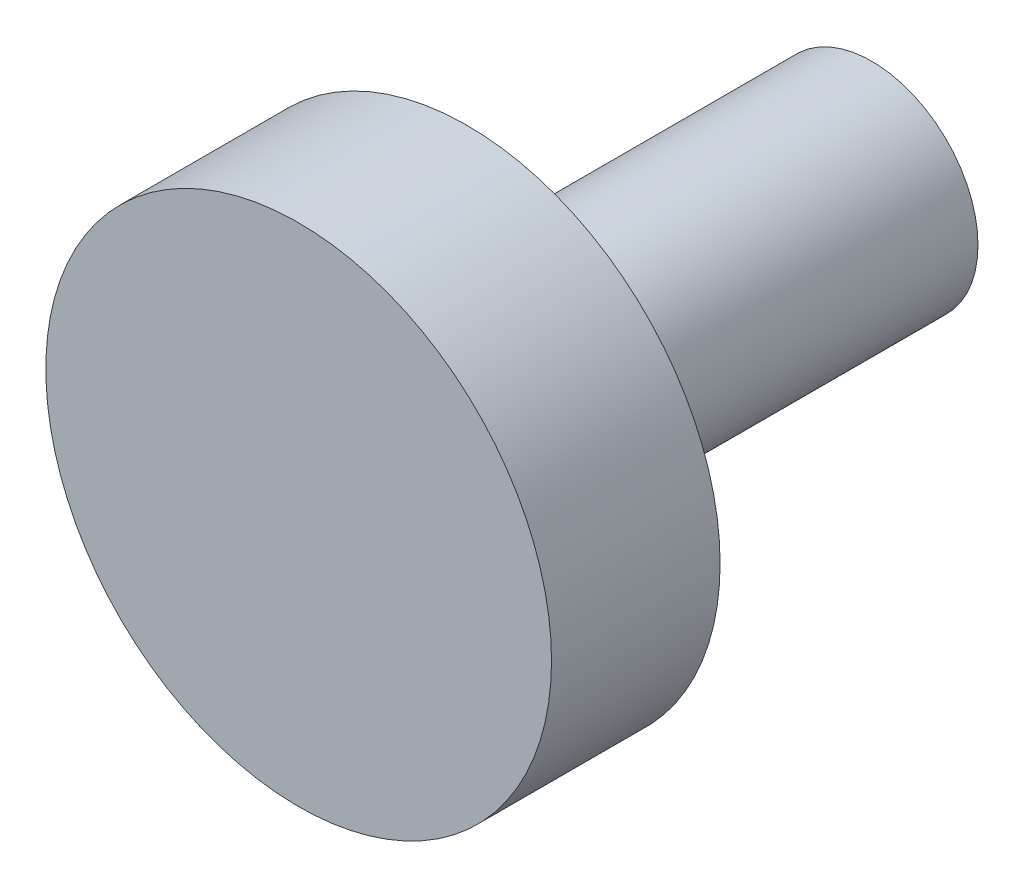
ISO-10303-21;
HEADER;
FILE_DESCRIPTION(('STEP AP214'),'2;1');
FILE_NAME('part.step','',(''),(''),'','','');
FILE_SCHEMA(('AUTOMOTIVE_DESIGN { 1 0 10303 214 1 1 1 1 }'));
ENDSEC;
DATA;
#1=APPLICATION_CONTEXT('core data for automotive mechanical design processes');
#2=APPLICATION_PROTOCOL_DEFINITION('international standard','automotive_design',2000,#1);
#3=PRODUCT_CONTEXT('',#1,'mechanical');
#4=PRODUCT('Part','Part','',(#3));
#5=PRODUCT_RELATED_PRODUCT_CATEGORY('part','',(#4));
#6=PRODUCT_DEFINITION_FORMATION('','',#4);
#7=PRODUCT_DEFINITION_CONTEXT('part definition',#1,'design');
#8=PRODUCT_DEFINITION('design','',#6,#7);
#9=PRODUCT_DEFINITION_SHAPE('','',#8);
#10=(LENGTH_UNIT() NAMED_UNIT(*) SI_UNIT(.MILLI.,.METRE.));
#11=(NAMED_UNIT(*) PLANE_ANGLE_UNIT() SI_UNIT($,.RADIAN.));
#12=(NAMED_UNIT(*) SI_UNIT($,.STERADIAN.) SOLID_ANGLE_UNIT());
#13=UNCERTAINTY_MEASURE_WITH_UNIT(LENGTH_MEASURE(1.E-05),#10,'distance_accuracy_value','');
#14=(GEOMETRIC_REPRESENTATION_CONTEXT(3) GLOBAL_UNCERTAINTY_ASSIGNED_CONTEXT((#13)) GLOBAL_UNIT_ASSIGNED_CONTEXT((#10,
#11,#12)) REPRESENTATION_CONTEXT('',''));
#15=CARTESIAN_POINT('',(0.,0.,0.));
#16=DIRECTION('',(0.,0.,1.));
#17=DIRECTION('',(1.,0.,0.));
#18=AXIS2_PLACEMENT_3D('',#15,#16,#17);
#19=CARTESIAN_POINT('',(0.,0.,6.35));
#20=DIRECTION('',(0.,0.,-1.));
#21=DIRECTION('',(-1.,0.,0.));
#22=AXIS2_PLACEMENT_3D('',#19,#20,#21);
#23=CYLINDRICAL_SURFACE('',#22,9.525);
#24=CARTESIAN_POINT('',(0.,0.,6.35));
#25=DIRECTION('',(0.,0.,1.));
#26=DIRECTION('',(1.,0.,0.));
#27=AXIS2_PLACEMENT_3D('',#24,#25,#26);
#28=CIRCLE('',#27,9.525);
#29=CARTESIAN_POINT('',(9.525,0.,6.35));
#30=VERTEX_POINT('',#29);
#31=EDGE_CURVE('E10',#30,#30,#28,.T.);
#32=ORIENTED_EDGE('',*,*,#31,.F.);
#33=EDGE_LOOP('',(#32));
#34=FACE_BOUND('',#33,.T.);
#35=CARTESIAN_POINT('',(0.,0.,0.));
#36=DIRECTION('',(0.,0.,1.));
#37=DIRECTION('',(1.,0.,0.));
#38=AXIS2_PLACEMENT_3D('',#35,#36,#37);
#39=CIRCLE('',#38,9.525);
#40=CARTESIAN_POINT('',(9.525,0.,0.));
#41=VERTEX_POINT('',#40);
#42=EDGE_CURVE('E44',#41,#41,#39,.T.);
#43=ORIENTED_EDGE('',*,*,#42,.T.);
#44=EDGE_LOOP('',(#43));
#45=FACE_BOUND('',#44,.T.);
#46=ADVANCED_FACE('F41',(#34,#45),#23,.T.);
#47=CARTESIAN_POINT('',(0.,0.,6.35));
#48=DIRECTION('',(0.,0.,1.));
#49=DIRECTION('',(1.,0.,0.));
#50=AXIS2_PLACEMENT_3D('',#47,#48,#49);
#51=PLANE('',#50);
#52=ORIENTED_EDGE('',*,*,#31,.T.);
#53=EDGE_LOOP('',(#52));
#54=FACE_BOUND('',#53,.T.);
#55=ADVANCED_FACE('F75',(#54),#51,.T.);
#56=CARTESIAN_POINT('',(0.,0.,0.));
#57=DIRECTION('',(0.,0.,1.));
#58=DIRECTION('',(1.,0.,0.));
#59=AXIS2_PLACEMENT_3D('',#56,#57,#58);
#60=PLANE('',#59);
#61=CARTESIAN_POINT('',(0.,0.,0.));
#62=DIRECTION('',(0.,0.,1.));
#63=DIRECTION('',(1.,0.,0.));
#64=AXIS2_PLACEMENT_3D('',#61,#62,#63);
#65=CIRCLE('',#64,4.);
#66=CARTESIAN_POINT('',(4.,0.,0.));
#67=VERTEX_POINT('',#66);
#68=EDGE_CURVE('E55',#67,#67,#65,.T.);
#69=ORIENTED_EDGE('',*,*,#68,.T.);
#70=EDGE_LOOP('',(#69));
#71=FACE_BOUND('',#70,.T.);
#72=ORIENTED_EDGE('',*,*,#42,.F.);
#73=EDGE_LOOP('',(#72));
#74=FACE_BOUND('',#73,.T.);
#75=ADVANCED_FACE('F72',(#71,#74),#60,.F.);
#76=CARTESIAN_POINT('',(0.,0.,-15.24));
#77=DIRECTION('',(0.,0.,1.));
#78=DIRECTION('',(1.,0.,0.));
#79=AXIS2_PLACEMENT_3D('',#76,#77,#78);
#80=CYLINDRICAL_SURFACE('',#79,4.);
#81=CARTESIAN_POINT('',(0.,0.,-15.24));
#82=DIRECTION('',(0.,0.,1.));
#83=DIRECTION('',(1.,0.,0.));
#84=AXIS2_PLACEMENT_3D('',#81,#82,#83);
#85=CIRCLE('',#84,4.);
#86=CARTESIAN_POINT('',(4.,0.,-15.24));
#87=VERTEX_POINT('',#86);
#88=EDGE_CURVE('E53',#87,#87,#85,.T.);
#89=CARTESIAN_POINT('',(4.,0.,-15.24));
#90=CARTESIAN_POINT('',(4.,0.,-15.08125));
#91=CARTESIAN_POINT('',(4.,0.,-14.9225));
#92=CARTESIAN_POINT('',(4.,0.,-14.605));
#93=CARTESIAN_POINT('',(4.,0.,-14.44625));
#94=CARTESIAN_POINT('',(4.,0.,-14.12875));
#95=CARTESIAN_POINT('',(4.,0.,-13.97));
#96=CARTESIAN_POINT('',(4.,0.,-13.6525));
#97=CARTESIAN_POINT('',(4.,0.,-13.49375));
#98=CARTESIAN_POINT('',(4.,0.,-13.17625));
#99=CARTESIAN_POINT('',(4.,0.,-13.0175));
#100=CARTESIAN_POINT('',(4.,0.,-12.7));
#101=CARTESIAN_POINT('',(4.,0.,-12.54125));
#102=CARTESIAN_POINT('',(4.,0.,-12.22375));
#103=CARTESIAN_POINT('',(4.,0.,-12.065));
#104=CARTESIAN_POINT('',(4.,0.,-11.7475));
#105=CARTESIAN_POINT('',(4.,0.,-11.58875));
#106=CARTESIAN_POINT('',(4.,0.,-11.27125));
#107=CARTESIAN_POINT('',(4.,0.,-11.1125));
#108=CARTESIAN_POINT('',(4.,0.,-10.795));
#109=CARTESIAN_POINT('',(4.,0.,-10.63625));
#110=CARTESIAN_POINT('',(4.,0.,-10.31875));
#111=CARTESIAN_POINT('',(4.,0.,-10.16));
#112=CARTESIAN_POINT('',(4.,0.,-9.8425));
#113=CARTESIAN_POINT('',(4.,0.,-9.68375));
#114=CARTESIAN_POINT('',(4.,0.,-9.36625));
#115=CARTESIAN_POINT('',(4.,0.,-9.2075));
#116=CARTESIAN_POINT('',(4.,0.,-8.89));
#117=CARTESIAN_POINT('',(4.,0.,-8.73125));
#118=CARTESIAN_POINT('',(4.,0.,-8.41375));
#119=CARTESIAN_POINT('',(4.,0.,-8.255));
#120=CARTESIAN_POINT('',(4.,0.,-7.9375));
#121=CARTESIAN_POINT('',(4.,0.,-7.77875));
#122=CARTESIAN_POINT('',(4.,0.,-7.46125));
#123=CARTESIAN_POINT('',(4.,0.,-7.3025));
#124=CARTESIAN_POINT('',(4.,0.,-6.985));
#125=CARTESIAN_POINT('',(4.,0.,-6.82625));
#126=CARTESIAN_POINT('',(4.,0.,-6.50875));
#127=CARTESIAN_POINT('',(4.,0.,-6.35));
#128=CARTESIAN_POINT('',(4.,0.,-6.0325));
#129=CARTESIAN_POINT('',(4.,0.,-5.87375));
#130=CARTESIAN_POINT('',(4.,0.,-5.55625));
#131=CARTESIAN_POINT('',(4.,0.,-5.3975));
#132=CARTESIAN_POINT('',(4.,0.,-5.08));
#133=CARTESIAN_POINT('',(4.,0.,-4.92125));
#134=CARTESIAN_POINT('',(4.,0.,-4.60375));
#135=CARTESIAN_POINT('',(4.,0.,-4.445));
#136=CARTESIAN_POINT('',(4.,0.,-4.1275));
#137=CARTESIAN_POINT('',(4.,0.,-3.96875));
#138=CARTESIAN_POINT('',(4.,0.,-3.65125));
#139=CARTESIAN_POINT('',(4.,0.,-3.4925));
#140=CARTESIAN_POINT('',(4.,0.,-3.175));
#141=CARTESIAN_POINT('',(4.,0.,-3.01625));
#142=CARTESIAN_POINT('',(4.,0.,-2.69875));
#143=CARTESIAN_POINT('',(4.,0.,-2.54));
#144=CARTESIAN_POINT('',(4.,0.,-2.2225));
#145=CARTESIAN_POINT('',(4.,0.,-2.06375));
#146=CARTESIAN_POINT('',(4.,0.,-1.74625));
#147=CARTESIAN_POINT('',(4.,0.,-1.5875));
#148=CARTESIAN_POINT('',(4.,0.,-1.27));
#149=CARTESIAN_POINT('',(4.,0.,-1.11125));
#150=CARTESIAN_POINT('',(4.,0.,-0.79375));
#151=CARTESIAN_POINT('',(4.,0.,-0.634999999999999));
#152=CARTESIAN_POINT('',(4.,0.,-0.3175));
#153=CARTESIAN_POINT('',(4.,0.,-0.15875));
#154=CARTESIAN_POINT('',(4.,0.,0.));
#155=B_SPLINE_CURVE_WITH_KNOTS('',3,(#89,#90,#91,#92,#93,#94,#95,#96,#97,#98,#99,#100,#101,#102,
#103,#104,#105,#106,#107,#108,#109,#110,#111,#112,#113,#114,#115,#116,#117,#118,#119,#120,#121,
#122,#123,#124,#125,#126,#127,#128,#129,#130,#131,#132,#133,#134,#135,#136,#137,#138,#139,#140,
#141,#142,#143,#144,#145,#146,#147,#148,#149,#150,#151,#152,#153,#154),.UNSPECIFIED.,.F.,.F.,(4,
2,2,2,2,2,2,2,2,2,2,2,2,2,2,2,2,2,2,2,2,2,2,2,2,2,2,2,2,2,2,2,4),(0.,0.476249999999999,
0.952499999999998,1.42875,1.905,2.38125,2.8575,3.33375,3.81,4.28625,4.7625,5.23875,5.715,
6.19125,6.6675,7.14375,7.62,8.09625,8.5725,9.04875,9.525,10.00125,10.4775,10.95375,11.43,
11.90625,12.3825,12.85875,13.335,13.81125,14.2875,14.76375,15.24),.UNSPECIFIED.);
#156=EDGE_CURVE('BSEAM63',#87,#67,#155,.T.);
#157=ORIENTED_EDGE('',*,*,#88,.T.);
#158=ORIENTED_EDGE('',*,*,#68,.F.);
#159=ORIENTED_EDGE('',*,*,#156,.T.);
#160=ORIENTED_EDGE('',*,*,#156,.F.);
#161=EDGE_LOOP('',(#157,#159,#158,#160));
#162=FACE_BOUND('',#161,.T.);
#163=ADVANCED_FACE('F63',(#162),#80,.T.);
#164=CARTESIAN_POINT('',(0.,0.,-15.24));
#165=DIRECTION('',(0.,0.,1.));
#166=DIRECTION('',(1.,0.,0.));
#167=AXIS2_PLACEMENT_3D('',#164,#165,#166);
#168=PLANE('',#167);
#169=ORIENTED_EDGE('',*,*,#88,.F.);
#170=EDGE_LOOP('',(#169));
#171=FACE_BOUND('',#170,.T.);
#172=ADVANCED_FACE('F66',(#171),#168,.F.);
#173=CLOSED_SHELL('',(#46,#55,#75,#163,#172));
#174=MANIFOLD_SOLID_BREP('B2',#173);
#175=ADVANCED_BREP_SHAPE_REPRESENTATION('',(#18,#174),#14);
#176=SHAPE_DEFINITION_REPRESENTATION(#9,#175);
ENDSEC;
END-ISO-10303-21;
